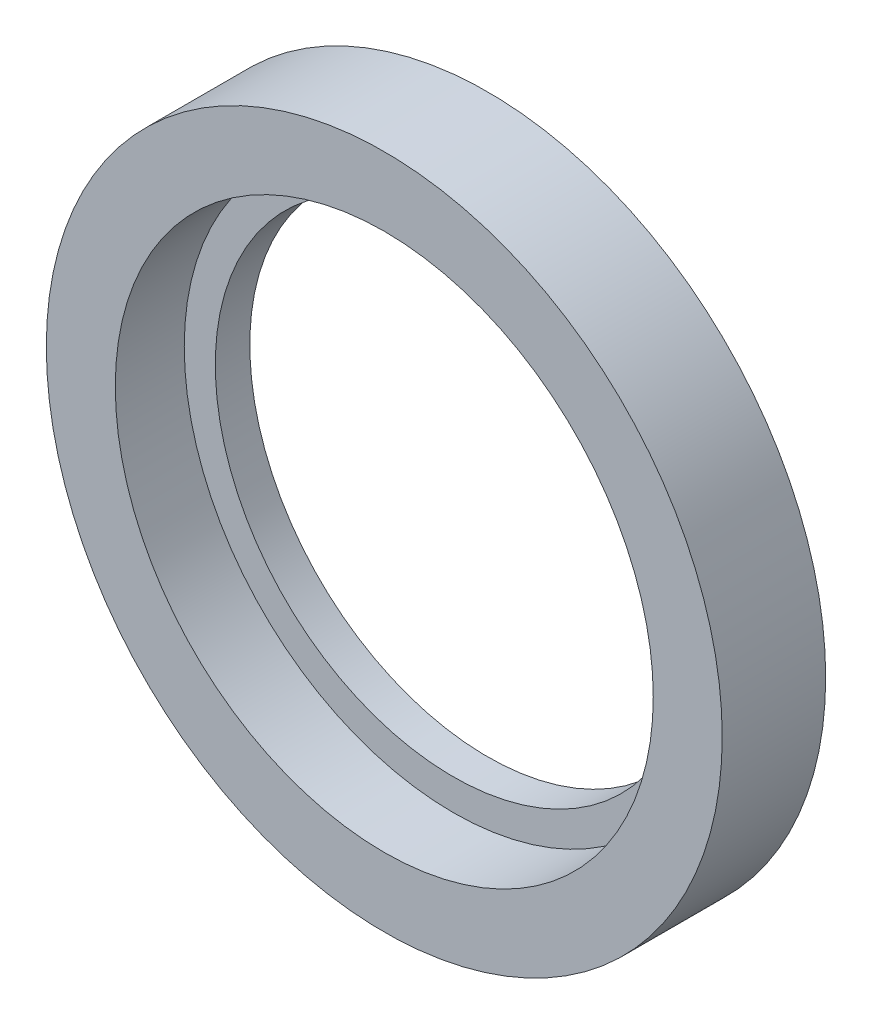
ISO-10303-21;
HEADER;
FILE_DESCRIPTION(('STEP AP214'),'2;1');
FILE_NAME('part.step','',(''),(''),'','','');
FILE_SCHEMA(('AUTOMOTIVE_DESIGN { 1 0 10303 214 1 1 1 1 }'));
ENDSEC;
DATA;
#1=APPLICATION_CONTEXT('core data for automotive mechanical design processes');
#2=APPLICATION_PROTOCOL_DEFINITION('international standard','automotive_design',2000,#1);
#3=PRODUCT_CONTEXT('',#1,'mechanical');
#4=PRODUCT('Part','Part','',(#3));
#5=PRODUCT_RELATED_PRODUCT_CATEGORY('part','',(#4));
#6=PRODUCT_DEFINITION_FORMATION('','',#4);
#7=PRODUCT_DEFINITION_CONTEXT('part definition',#1,'design');
#8=PRODUCT_DEFINITION('design','',#6,#7);
#9=PRODUCT_DEFINITION_SHAPE('','',#8);
#10=(LENGTH_UNIT() NAMED_UNIT(*) SI_UNIT(.MILLI.,.METRE.));
#11=(NAMED_UNIT(*) PLANE_ANGLE_UNIT() SI_UNIT($,.RADIAN.));
#12=(NAMED_UNIT(*) SI_UNIT($,.STERADIAN.) SOLID_ANGLE_UNIT());
#13=UNCERTAINTY_MEASURE_WITH_UNIT(LENGTH_MEASURE(1.E-05),#10,'distance_accuracy_value','');
#14=(GEOMETRIC_REPRESENTATION_CONTEXT(3) GLOBAL_UNCERTAINTY_ASSIGNED_CONTEXT((#13)) GLOBAL_UNIT_ASSIGNED_CONTEXT((#10,
#11,#12)) REPRESENTATION_CONTEXT('',''));
#15=CARTESIAN_POINT('',(0.,0.,0.));
#16=DIRECTION('',(0.,0.,1.));
#17=DIRECTION('',(1.,0.,0.));
#18=AXIS2_PLACEMENT_3D('',#15,#16,#17);
#19=CARTESIAN_POINT('',(0.,0.,15.));
#20=DIRECTION('',(0.,0.,-1.));
#21=DIRECTION('',(-1.,0.,0.));
#22=AXIS2_PLACEMENT_3D('',#19,#20,#21);
#23=CYLINDRICAL_SURFACE('',#22,34.5);
#24=CARTESIAN_POINT('',(0.,0.,0.));
#25=DIRECTION('',(0.,0.,1.));
#26=DIRECTION('',(1.,0.,0.));
#27=AXIS2_PLACEMENT_3D('',#24,#25,#26);
#28=CIRCLE('',#27,34.5);
#29=CARTESIAN_POINT('',(34.5,0.,0.));
#30=VERTEX_POINT('',#29);
#31=EDGE_CURVE('E49',#30,#30,#28,.T.);
#32=ORIENTED_EDGE('',*,*,#31,.F.);
#33=EDGE_LOOP('',(#32));
#34=FACE_BOUND('',#33,.T.);
#35=CARTESIAN_POINT('',(0.,0.,5.));
#36=DIRECTION('',(0.,0.,1.));
#37=DIRECTION('',(1.,0.,0.));
#38=AXIS2_PLACEMENT_3D('',#35,#36,#37);
#39=CIRCLE('',#38,34.5);
#40=CARTESIAN_POINT('',(34.5,0.,5.));
#41=VERTEX_POINT('',#40);
#42=EDGE_CURVE('E41',#41,#41,#39,.T.);
#43=ORIENTED_EDGE('',*,*,#42,.T.);
#44=EDGE_LOOP('',(#43));
#45=FACE_BOUND('',#44,.T.);
#46=ADVANCED_FACE('F40',(#34,#45),#23,.F.);
#47=CARTESIAN_POINT('',(0.,0.,15.));
#48=DIRECTION('',(0.,0.,1.));
#49=DIRECTION('',(1.,0.,0.));
#50=AXIS2_PLACEMENT_3D('',#47,#48,#49);
#51=PLANE('',#50);
#52=CARTESIAN_POINT('',(0.,0.,15.));
#53=DIRECTION('',(0.,0.,1.));
#54=DIRECTION('',(1.,0.,0.));
#55=AXIS2_PLACEMENT_3D('',#52,#53,#54);
#56=CIRCLE('',#55,39.);
#57=CARTESIAN_POINT('',(39.,0.,15.));
#58=VERTEX_POINT('',#57);
#59=EDGE_CURVE('E89',#58,#58,#56,.T.);
#60=ORIENTED_EDGE('',*,*,#59,.F.);
#61=EDGE_LOOP('',(#60));
#62=FACE_BOUND('',#61,.T.);
#63=CARTESIAN_POINT('',(0.,0.,15.));
#64=DIRECTION('',(0.,0.,1.));
#65=DIRECTION('',(1.,0.,0.));
#66=AXIS2_PLACEMENT_3D('',#63,#64,#65);
#67=CIRCLE('',#66,49.);
#68=CARTESIAN_POINT('',(49.,0.,15.));
#69=VERTEX_POINT('',#68);
#70=EDGE_CURVE('E10',#69,#69,#67,.T.);
#71=ORIENTED_EDGE('',*,*,#70,.T.);
#72=EDGE_LOOP('',(#71));
#73=FACE_BOUND('',#72,.T.);
#74=ADVANCED_FACE('F115',(#62,#73),#51,.T.);
#75=CARTESIAN_POINT('',(0.,0.,0.));
#76=DIRECTION('',(0.,0.,1.));
#77=DIRECTION('',(1.,0.,0.));
#78=AXIS2_PLACEMENT_3D('',#75,#76,#77);
#79=PLANE('',#78);
#80=CARTESIAN_POINT('',(-22.0000000000004,38.105117766515,0.));
#81=DIRECTION('',(0.,0.,-1.));
#82=DIRECTION('',(-0.50000000000001,0.866025403784433,0.));
#83=AXIS2_PLACEMENT_3D('',#80,#81,#82);
#84=CIRCLE('',#83,3.3);
#85=CARTESIAN_POINT('',(-23.6500000000005,40.9630015990037,0.));
#86=VERTEX_POINT('',#85);
#87=EDGE_CURVE('E70',#86,#86,#84,.T.);
#88=ORIENTED_EDGE('',*,*,#87,.F.);
#89=EDGE_LOOP('',(#88));
#90=FACE_BOUND('',#89,.T.);
#91=CARTESIAN_POINT('',(21.9999999999996,38.1051177665155,0.));
#92=DIRECTION('',(0.,0.,-1.));
#93=DIRECTION('',(0.499999999999992,0.866025403784443,0.));
#94=AXIS2_PLACEMENT_3D('',#91,#92,#93);
#95=CIRCLE('',#94,3.3);
#96=CARTESIAN_POINT('',(23.6499999999996,40.9630015990042,0.));
#97=VERTEX_POINT('',#96);
#98=EDGE_CURVE('E71',#97,#97,#95,.T.);
#99=ORIENTED_EDGE('',*,*,#98,.F.);
#100=EDGE_LOOP('',(#99));
#101=FACE_BOUND('',#100,.T.);
#102=CARTESIAN_POINT('',(44.,0.,0.));
#103=DIRECTION('',(0.,0.,-1.));
#104=DIRECTION('',(1.,0.,0.));
#105=AXIS2_PLACEMENT_3D('',#102,#103,#104);
#106=CIRCLE('',#105,3.3);
#107=CARTESIAN_POINT('',(47.3,0.,0.));
#108=VERTEX_POINT('',#107);
#109=EDGE_CURVE('E78',#108,#108,#106,.T.);
#110=ORIENTED_EDGE('',*,*,#109,.F.);
#111=EDGE_LOOP('',(#110));
#112=FACE_BOUND('',#111,.T.);
#113=CARTESIAN_POINT('',(22.0000000000002,-38.1051177665152,0.));
#114=DIRECTION('',(0.,0.,-1.));
#115=DIRECTION('',(0.500000000000004,-0.866025403784436,0.));
#116=AXIS2_PLACEMENT_3D('',#113,#114,#115);
#117=CIRCLE('',#116,3.3);
#118=CARTESIAN_POINT('',(23.6500000000002,-40.9630015990038,0.));
#119=VERTEX_POINT('',#118);
#120=EDGE_CURVE('E84',#119,#119,#117,.T.);
#121=ORIENTED_EDGE('',*,*,#120,.F.);
#122=EDGE_LOOP('',(#121));
#123=FACE_BOUND('',#122,.T.);
#124=CARTESIAN_POINT('',(-21.9999999999999,-38.1051177665153,0.));
#125=DIRECTION('',(0.,0.,-1.));
#126=DIRECTION('',(-0.499999999999998,-0.86602540378444,0.));
#127=AXIS2_PLACEMENT_3D('',#124,#125,#126);
#128=CIRCLE('',#127,3.3);
#129=CARTESIAN_POINT('',(-23.6499999999999,-40.963001599004,0.));
#130=VERTEX_POINT('',#129);
#131=EDGE_CURVE('E61',#130,#130,#128,.T.);
#132=ORIENTED_EDGE('',*,*,#131,.F.);
#133=EDGE_LOOP('',(#132));
#134=FACE_BOUND('',#133,.T.);
#135=CARTESIAN_POINT('',(-44.,0.,0.));
#136=DIRECTION('',(0.,0.,-1.));
#137=DIRECTION('',(-1.,0.,0.));
#138=AXIS2_PLACEMENT_3D('',#135,#136,#137);
#139=CIRCLE('',#138,3.3);
#140=CARTESIAN_POINT('',(-47.3,0.,0.));
#141=VERTEX_POINT('',#140);
#142=EDGE_CURVE('E54',#141,#141,#139,.T.);
#143=ORIENTED_EDGE('',*,*,#142,.F.);
#144=EDGE_LOOP('',(#143));
#145=FACE_BOUND('',#144,.T.);
#146=CARTESIAN_POINT('',(0.,0.,0.));
#147=DIRECTION('',(0.,0.,1.));
#148=DIRECTION('',(1.,0.,0.));
#149=AXIS2_PLACEMENT_3D('',#146,#147,#148);
#150=CIRCLE('',#149,49.);
#151=CARTESIAN_POINT('',(49.,0.,0.));
#152=VERTEX_POINT('',#151);
#153=EDGE_CURVE('E44',#152,#152,#150,.T.);
#154=ORIENTED_EDGE('',*,*,#153,.F.);
#155=EDGE_LOOP('',(#154));
#156=FACE_BOUND('',#155,.T.);
#157=ORIENTED_EDGE('',*,*,#31,.T.);
#158=EDGE_LOOP('',(#157));
#159=FACE_BOUND('',#158,.T.);
#160=ADVANCED_FACE('F118',(#90,#101,#112,#123,#134,#145,#156,#159),#79,.F.);
#161=CARTESIAN_POINT('',(0.,0.,15.));
#162=DIRECTION('',(0.,0.,-1.));
#163=DIRECTION('',(-1.,0.,0.));
#164=AXIS2_PLACEMENT_3D('',#161,#162,#163);
#165=CYLINDRICAL_SURFACE('',#164,49.);
#166=ORIENTED_EDGE('',*,*,#70,.F.);
#167=EDGE_LOOP('',(#166));
#168=FACE_BOUND('',#167,.T.);
#169=ORIENTED_EDGE('',*,*,#153,.T.);
#170=EDGE_LOOP('',(#169));
#171=FACE_BOUND('',#170,.T.);
#172=ADVANCED_FACE('F39',(#168,#171),#165,.T.);
#173=CARTESIAN_POINT('',(-44.,0.,6.));
#174=DIRECTION('',(0.,0.,-1.));
#175=DIRECTION('',(-1.,0.,0.));
#176=AXIS2_PLACEMENT_3D('',#173,#174,#175);
#177=CYLINDRICAL_SURFACE('',#176,3.3);
#178=CARTESIAN_POINT('',(-44.,0.,6.));
#179=DIRECTION('',(0.,0.,-1.));
#180=DIRECTION('',(-1.,0.,0.));
#181=AXIS2_PLACEMENT_3D('',#178,#179,#180);
#182=CIRCLE('',#181,3.3);
#183=CARTESIAN_POINT('',(-47.3,0.,6.));
#184=VERTEX_POINT('',#183);
#185=EDGE_CURVE('E53',#184,#184,#182,.T.);
#186=ORIENTED_EDGE('',*,*,#185,.F.);
#187=EDGE_LOOP('',(#186));
#188=FACE_BOUND('',#187,.T.);
#189=ORIENTED_EDGE('',*,*,#142,.T.);
#190=EDGE_LOOP('',(#189));
#191=FACE_BOUND('',#190,.T.);
#192=ADVANCED_FACE('F123',(#188,#191),#177,.F.);
#193=CARTESIAN_POINT('',(-44.,0.,6.));
#194=DIRECTION('',(0.,0.,-1.));
#195=DIRECTION('',(-1.,0.,0.));
#196=AXIS2_PLACEMENT_3D('',#193,#194,#195);
#197=PLANE('',#196);
#198=ORIENTED_EDGE('',*,*,#185,.T.);
#199=EDGE_LOOP('',(#198));
#200=FACE_BOUND('',#199,.T.);
#201=ADVANCED_FACE('F151',(#200),#197,.T.);
#202=CARTESIAN_POINT('',(-21.9999999999999,-38.1051177665153,6.));
#203=DIRECTION('',(0.,0.,-1.));
#204=DIRECTION('',(-1.,0.,0.));
#205=AXIS2_PLACEMENT_3D('',#202,#203,#204);
#206=CYLINDRICAL_SURFACE('',#205,3.3);
#207=CARTESIAN_POINT('',(-21.9999999999999,-38.1051177665153,6.));
#208=DIRECTION('',(0.,0.,-1.));
#209=DIRECTION('',(-0.499999999999998,-0.86602540378444,0.));
#210=AXIS2_PLACEMENT_3D('',#207,#208,#209);
#211=CIRCLE('',#210,3.3);
#212=CARTESIAN_POINT('',(-23.6499999999999,-40.963001599004,6.));
#213=VERTEX_POINT('',#212);
#214=EDGE_CURVE('E59',#213,#213,#211,.T.);
#215=ORIENTED_EDGE('',*,*,#214,.F.);
#216=EDGE_LOOP('',(#215));
#217=FACE_BOUND('',#216,.T.);
#218=ORIENTED_EDGE('',*,*,#131,.T.);
#219=EDGE_LOOP('',(#218));
#220=FACE_BOUND('',#219,.T.);
#221=ADVANCED_FACE('F154',(#217,#220),#206,.F.);
#222=CARTESIAN_POINT('',(-21.9999999999999,-38.1051177665153,6.));
#223=DIRECTION('',(0.,0.,-1.));
#224=DIRECTION('',(-0.499999999999998,-0.86602540378444,0.));
#225=AXIS2_PLACEMENT_3D('',#222,#223,#224);
#226=PLANE('',#225);
#227=ORIENTED_EDGE('',*,*,#214,.T.);
#228=EDGE_LOOP('',(#227));
#229=FACE_BOUND('',#228,.T.);
#230=ADVANCED_FACE('F159',(#229),#226,.T.);
#231=CARTESIAN_POINT('',(22.0000000000002,-38.1051177665152,6.));
#232=DIRECTION('',(0.,0.,-1.));
#233=DIRECTION('',(-1.,0.,0.));
#234=AXIS2_PLACEMENT_3D('',#231,#232,#233);
#235=CYLINDRICAL_SURFACE('',#234,3.3);
#236=CARTESIAN_POINT('',(22.0000000000002,-38.1051177665152,6.));
#237=DIRECTION('',(0.,0.,-1.));
#238=DIRECTION('',(0.500000000000004,-0.866025403784436,0.));
#239=AXIS2_PLACEMENT_3D('',#236,#237,#238);
#240=CIRCLE('',#239,3.3);
#241=CARTESIAN_POINT('',(23.6500000000002,-40.9630015990038,6.));
#242=VERTEX_POINT('',#241);
#243=EDGE_CURVE('E63',#242,#242,#240,.T.);
#244=ORIENTED_EDGE('',*,*,#243,.F.);
#245=EDGE_LOOP('',(#244));
#246=FACE_BOUND('',#245,.T.);
#247=ORIENTED_EDGE('',*,*,#120,.T.);
#248=EDGE_LOOP('',(#247));
#249=FACE_BOUND('',#248,.T.);
#250=ADVANCED_FACE('F167',(#246,#249),#235,.F.);
#251=CARTESIAN_POINT('',(22.0000000000002,-38.1051177665152,6.));
#252=DIRECTION('',(0.,0.,-1.));
#253=DIRECTION('',(0.500000000000004,-0.866025403784436,0.));
#254=AXIS2_PLACEMENT_3D('',#251,#252,#253);
#255=PLANE('',#254);
#256=ORIENTED_EDGE('',*,*,#243,.T.);
#257=EDGE_LOOP('',(#256));
#258=FACE_BOUND('',#257,.T.);
#259=ADVANCED_FACE('F186',(#258),#255,.T.);
#260=CARTESIAN_POINT('',(44.,0.,6.));
#261=DIRECTION('',(0.,0.,-1.));
#262=DIRECTION('',(-1.,0.,0.));
#263=AXIS2_PLACEMENT_3D('',#260,#261,#262);
#264=CYLINDRICAL_SURFACE('',#263,3.3);
#265=CARTESIAN_POINT('',(44.,0.,6.));
#266=DIRECTION('',(0.,0.,-1.));
#267=DIRECTION('',(1.,0.,0.));
#268=AXIS2_PLACEMENT_3D('',#265,#266,#267);
#269=CIRCLE('',#268,3.3);
#270=CARTESIAN_POINT('',(47.3,0.,6.));
#271=VERTEX_POINT('',#270);
#272=EDGE_CURVE('E85',#271,#271,#269,.T.);
#273=ORIENTED_EDGE('',*,*,#272,.F.);
#274=EDGE_LOOP('',(#273));
#275=FACE_BOUND('',#274,.T.);
#276=ORIENTED_EDGE('',*,*,#109,.T.);
#277=EDGE_LOOP('',(#276));
#278=FACE_BOUND('',#277,.T.);
#279=ADVANCED_FACE('F181',(#275,#278),#264,.F.);
#280=CARTESIAN_POINT('',(44.,0.,6.));
#281=DIRECTION('',(0.,0.,-1.));
#282=DIRECTION('',(1.,0.,0.));
#283=AXIS2_PLACEMENT_3D('',#280,#281,#282);
#284=PLANE('',#283);
#285=ORIENTED_EDGE('',*,*,#272,.T.);
#286=EDGE_LOOP('',(#285));
#287=FACE_BOUND('',#286,.T.);
#288=ADVANCED_FACE('F177',(#287),#284,.T.);
#289=CARTESIAN_POINT('',(21.9999999999996,38.1051177665155,6.));
#290=DIRECTION('',(0.,0.,-1.));
#291=DIRECTION('',(-1.,0.,0.));
#292=AXIS2_PLACEMENT_3D('',#289,#290,#291);
#293=CYLINDRICAL_SURFACE('',#292,3.3);
#294=CARTESIAN_POINT('',(21.9999999999996,38.1051177665155,6.));
#295=DIRECTION('',(0.,0.,-1.));
#296=DIRECTION('',(0.499999999999992,0.866025403784443,0.));
#297=AXIS2_PLACEMENT_3D('',#294,#295,#296);
#298=CIRCLE('',#297,3.3);
#299=CARTESIAN_POINT('',(23.6499999999996,40.9630015990042,6.));
#300=VERTEX_POINT('',#299);
#301=EDGE_CURVE('E76',#300,#300,#298,.T.);
#302=ORIENTED_EDGE('',*,*,#301,.F.);
#303=EDGE_LOOP('',(#302));
#304=FACE_BOUND('',#303,.T.);
#305=ORIENTED_EDGE('',*,*,#98,.T.);
#306=EDGE_LOOP('',(#305));
#307=FACE_BOUND('',#306,.T.);
#308=ADVANCED_FACE('F174',(#304,#307),#293,.F.);
#309=CARTESIAN_POINT('',(21.9999999999996,38.1051177665155,6.));
#310=DIRECTION('',(0.,0.,-1.));
#311=DIRECTION('',(0.499999999999992,0.866025403784443,0.));
#312=AXIS2_PLACEMENT_3D('',#309,#310,#311);
#313=PLANE('',#312);
#314=ORIENTED_EDGE('',*,*,#301,.T.);
#315=EDGE_LOOP('',(#314));
#316=FACE_BOUND('',#315,.T.);
#317=ADVANCED_FACE('F171',(#316),#313,.T.);
#318=CARTESIAN_POINT('',(-22.0000000000004,38.105117766515,6.));
#319=DIRECTION('',(0.,0.,-1.));
#320=DIRECTION('',(-1.,0.,0.));
#321=AXIS2_PLACEMENT_3D('',#318,#319,#320);
#322=CYLINDRICAL_SURFACE('',#321,3.3);
#323=CARTESIAN_POINT('',(-22.0000000000004,38.105117766515,6.));
#324=DIRECTION('',(0.,0.,-1.));
#325=DIRECTION('',(-0.50000000000001,0.866025403784433,0.));
#326=AXIS2_PLACEMENT_3D('',#323,#324,#325);
#327=CIRCLE('',#326,3.3);
#328=CARTESIAN_POINT('',(-23.6500000000005,40.9630015990037,6.));
#329=VERTEX_POINT('',#328);
#330=EDGE_CURVE('E69',#329,#329,#327,.T.);
#331=ORIENTED_EDGE('',*,*,#330,.F.);
#332=EDGE_LOOP('',(#331));
#333=FACE_BOUND('',#332,.T.);
#334=ORIENTED_EDGE('',*,*,#87,.T.);
#335=EDGE_LOOP('',(#334));
#336=FACE_BOUND('',#335,.T.);
#337=ADVANCED_FACE('F169',(#333,#336),#322,.F.);
#338=CARTESIAN_POINT('',(-22.0000000000004,38.105117766515,6.));
#339=DIRECTION('',(0.,0.,-1.));
#340=DIRECTION('',(-0.50000000000001,0.866025403784433,0.));
#341=AXIS2_PLACEMENT_3D('',#338,#339,#340);
#342=PLANE('',#341);
#343=ORIENTED_EDGE('',*,*,#330,.T.);
#344=EDGE_LOOP('',(#343));
#345=FACE_BOUND('',#344,.T.);
#346=ADVANCED_FACE('F107',(#345),#342,.T.);
#347=CARTESIAN_POINT('',(0.,0.,5.));
#348=DIRECTION('',(0.,0.,1.));
#349=DIRECTION('',(1.,0.,0.));
#350=AXIS2_PLACEMENT_3D('',#347,#348,#349);
#351=CYLINDRICAL_SURFACE('',#350,39.);
#352=CARTESIAN_POINT('',(0.,0.,5.));
#353=DIRECTION('',(0.,0.,1.));
#354=DIRECTION('',(1.,0.,0.));
#355=AXIS2_PLACEMENT_3D('',#352,#353,#354);
#356=CIRCLE('',#355,39.);
#357=CARTESIAN_POINT('',(39.,0.,5.));
#358=VERTEX_POINT('',#357);
#359=EDGE_CURVE('E91',#358,#358,#356,.T.);
#360=ORIENTED_EDGE('',*,*,#359,.F.);
#361=EDGE_LOOP('',(#360));
#362=FACE_BOUND('',#361,.T.);
#363=ORIENTED_EDGE('',*,*,#59,.T.);
#364=EDGE_LOOP('',(#363));
#365=FACE_BOUND('',#364,.T.);
#366=ADVANCED_FACE('F103',(#362,#365),#351,.F.);
#367=CARTESIAN_POINT('',(0.,0.,5.));
#368=DIRECTION('',(0.,0.,1.));
#369=DIRECTION('',(1.,0.,0.));
#370=AXIS2_PLACEMENT_3D('',#367,#368,#369);
#371=PLANE('',#370);
#372=ORIENTED_EDGE('',*,*,#42,.F.);
#373=EDGE_LOOP('',(#372));
#374=FACE_BOUND('',#373,.T.);
#375=ORIENTED_EDGE('',*,*,#359,.T.);
#376=EDGE_LOOP('',(#375));
#377=FACE_BOUND('',#376,.T.);
#378=ADVANCED_FACE('F101',(#374,#377),#371,.T.);
#379=CLOSED_SHELL('',(#46,#74,#160,#172,#192,#201,#221,#230,#250,#259,#279,#288,#308,#317,#337,
#346,#366,#378));
#380=MANIFOLD_SOLID_BREP('B2',#379);
#381=ADVANCED_BREP_SHAPE_REPRESENTATION('',(#18,#380),#14);
#382=SHAPE_DEFINITION_REPRESENTATION(#9,#381);
ENDSEC;
END-ISO-10303-21;
